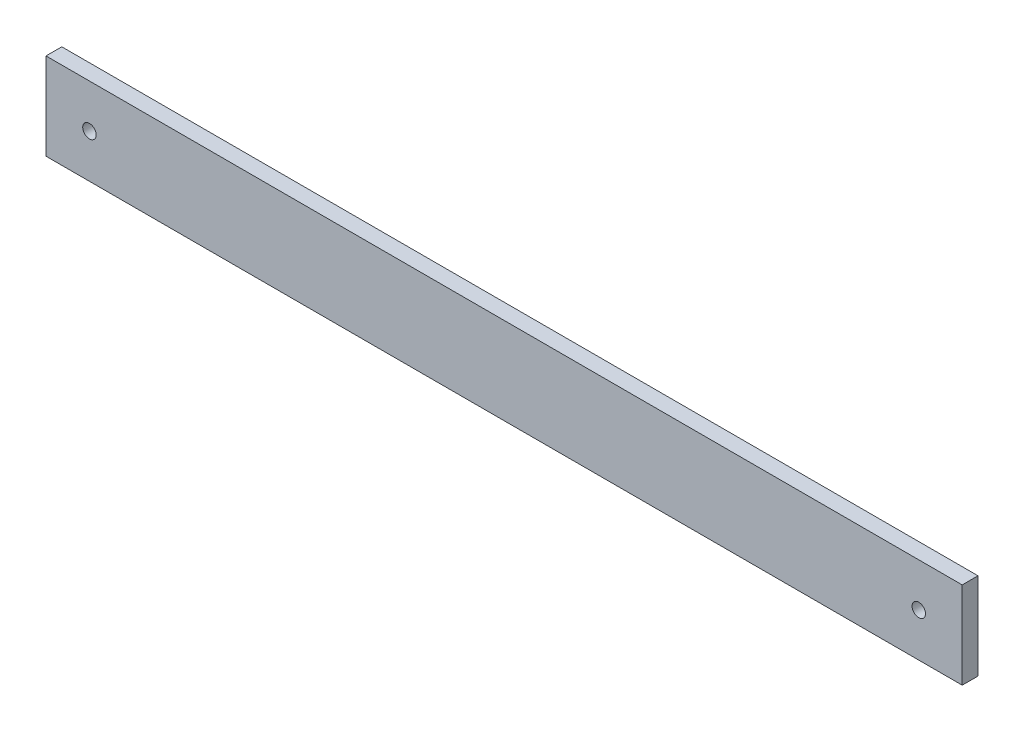
ISO-10303-21;
HEADER;
FILE_DESCRIPTION(('STEP AP214'),'2;1');
FILE_NAME('part.step','',(''),(''),'','','');
FILE_SCHEMA(('AUTOMOTIVE_DESIGN { 1 0 10303 214 1 1 1 1 }'));
ENDSEC;
DATA;
#1=APPLICATION_CONTEXT('core data for automotive mechanical design processes');
#2=APPLICATION_PROTOCOL_DEFINITION('international standard','automotive_design',2000,#1);
#3=PRODUCT_CONTEXT('',#1,'mechanical');
#4=PRODUCT('Part','Part','',(#3));
#5=PRODUCT_RELATED_PRODUCT_CATEGORY('part','',(#4));
#6=PRODUCT_DEFINITION_FORMATION('','',#4);
#7=PRODUCT_DEFINITION_CONTEXT('part definition',#1,'design');
#8=PRODUCT_DEFINITION('design','',#6,#7);
#9=PRODUCT_DEFINITION_SHAPE('','',#8);
#10=(LENGTH_UNIT() NAMED_UNIT(*) SI_UNIT(.MILLI.,.METRE.));
#11=(NAMED_UNIT(*) PLANE_ANGLE_UNIT() SI_UNIT($,.RADIAN.));
#12=(NAMED_UNIT(*) SI_UNIT($,.STERADIAN.) SOLID_ANGLE_UNIT());
#13=UNCERTAINTY_MEASURE_WITH_UNIT(LENGTH_MEASURE(1.E-05),#10,'distance_accuracy_value','');
#14=(GEOMETRIC_REPRESENTATION_CONTEXT(3) GLOBAL_UNCERTAINTY_ASSIGNED_CONTEXT((#13)) GLOBAL_UNIT_ASSIGNED_CONTEXT((#10,
#11,#12)) REPRESENTATION_CONTEXT('',''));
#15=CARTESIAN_POINT('',(0.,0.,0.));
#16=DIRECTION('',(0.,0.,1.));
#17=DIRECTION('',(1.,0.,0.));
#18=AXIS2_PLACEMENT_3D('',#15,#16,#17);
#19=CARTESIAN_POINT('',(0.,0.,2.));
#20=DIRECTION('',(0.,0.,-1.));
#21=DIRECTION('',(-1.,0.,0.));
#22=AXIS2_PLACEMENT_3D('',#19,#20,#21);
#23=PLANE('',#22);
#24=DIRECTION('',(0.,1.,0.));
#25=VECTOR('',#24,1.);
#26=CARTESIAN_POINT('',(221.,-11.,2.));
#27=LINE('',#26,#25);
#28=CARTESIAN_POINT('',(221.,-11.,2.));
#29=VERTEX_POINT('',#28);
#30=CARTESIAN_POINT('',(221.,11.,2.));
#31=VERTEX_POINT('',#30);
#32=EDGE_CURVE('E99',#29,#31,#27,.T.);
#33=ORIENTED_EDGE('',*,*,#32,.T.);
#34=DIRECTION('',(-1.,0.,0.));
#35=VECTOR('',#34,1.);
#36=CARTESIAN_POINT('',(-11.,11.,2.));
#37=LINE('',#36,#35);
#38=CARTESIAN_POINT('',(-11.,11.,2.));
#39=VERTEX_POINT('',#38);
#40=EDGE_CURVE('E92',#31,#39,#37,.T.);
#41=ORIENTED_EDGE('',*,*,#40,.T.);
#42=DIRECTION('',(0.,-1.,0.));
#43=VECTOR('',#42,1.);
#44=CARTESIAN_POINT('',(-11.,-11.,2.));
#45=LINE('',#44,#43);
#46=CARTESIAN_POINT('',(-11.,-11.,2.));
#47=VERTEX_POINT('',#46);
#48=EDGE_CURVE('E98',#39,#47,#45,.T.);
#49=ORIENTED_EDGE('',*,*,#48,.T.);
#50=DIRECTION('',(1.,0.,0.));
#51=VECTOR('',#50,1.);
#52=CARTESIAN_POINT('',(-11.,-11.,2.));
#53=LINE('',#52,#51);
#54=EDGE_CURVE('E63',#47,#29,#53,.T.);
#55=ORIENTED_EDGE('',*,*,#54,.T.);
#56=EDGE_LOOP('',(#33,#41,#49,#55));
#57=FACE_BOUND('',#56,.T.);
#58=CARTESIAN_POINT('',(0.,0.,2.));
#59=DIRECTION('',(0.,0.,1.));
#60=DIRECTION('',(1.,0.,0.));
#61=AXIS2_PLACEMENT_3D('',#58,#59,#60);
#62=CIRCLE('',#61,1.7);
#63=CARTESIAN_POINT('',(1.7,0.,2.));
#64=VERTEX_POINT('',#63);
#65=EDGE_CURVE('E113',#64,#64,#62,.T.);
#66=ORIENTED_EDGE('',*,*,#65,.F.);
#67=EDGE_LOOP('',(#66));
#68=FACE_BOUND('',#67,.T.);
#69=CARTESIAN_POINT('',(210.,0.,2.));
#70=DIRECTION('',(0.,0.,1.));
#71=DIRECTION('',(1.,0.,0.));
#72=AXIS2_PLACEMENT_3D('',#69,#70,#71);
#73=CIRCLE('',#72,1.70000000000001);
#74=CARTESIAN_POINT('',(211.7,0.,2.));
#75=VERTEX_POINT('',#74);
#76=EDGE_CURVE('E128',#75,#75,#73,.T.);
#77=ORIENTED_EDGE('',*,*,#76,.F.);
#78=EDGE_LOOP('',(#77));
#79=FACE_BOUND('',#78,.T.);
#80=ADVANCED_FACE('F50',(#57,#68,#79),#23,.F.);
#81=CARTESIAN_POINT('',(0.,0.,-2.));
#82=DIRECTION('',(0.,0.,-1.));
#83=DIRECTION('',(-1.,0.,0.));
#84=AXIS2_PLACEMENT_3D('',#81,#82,#83);
#85=PLANE('',#84);
#86=CARTESIAN_POINT('',(0.,0.,-2.));
#87=DIRECTION('',(0.,0.,1.));
#88=DIRECTION('',(1.,0.,0.));
#89=AXIS2_PLACEMENT_3D('',#86,#87,#88);
#90=CIRCLE('',#89,1.7);
#91=CARTESIAN_POINT('',(1.7,0.,-2.));
#92=VERTEX_POINT('',#91);
#93=EDGE_CURVE('E130',#92,#92,#90,.T.);
#94=ORIENTED_EDGE('',*,*,#93,.T.);
#95=EDGE_LOOP('',(#94));
#96=FACE_BOUND('',#95,.T.);
#97=DIRECTION('',(0.,1.,0.));
#98=VECTOR('',#97,1.);
#99=CARTESIAN_POINT('',(221.,-11.,-2.));
#100=LINE('',#99,#98);
#101=CARTESIAN_POINT('',(221.,-11.,-2.));
#102=VERTEX_POINT('',#101);
#103=CARTESIAN_POINT('',(221.,11.,-2.));
#104=VERTEX_POINT('',#103);
#105=EDGE_CURVE('E115',#102,#104,#100,.T.);
#106=ORIENTED_EDGE('',*,*,#105,.F.);
#107=DIRECTION('',(1.,0.,0.));
#108=VECTOR('',#107,1.);
#109=CARTESIAN_POINT('',(-11.,-11.,-2.));
#110=LINE('',#109,#108);
#111=CARTESIAN_POINT('',(-11.,-11.,-2.));
#112=VERTEX_POINT('',#111);
#113=EDGE_CURVE('E86',#112,#102,#110,.T.);
#114=ORIENTED_EDGE('',*,*,#113,.F.);
#115=DIRECTION('',(0.,-1.,0.));
#116=VECTOR('',#115,1.);
#117=CARTESIAN_POINT('',(-11.,-11.,-2.));
#118=LINE('',#117,#116);
#119=CARTESIAN_POINT('',(-11.,11.,-2.));
#120=VERTEX_POINT('',#119);
#121=EDGE_CURVE('E82',#120,#112,#118,.T.);
#122=ORIENTED_EDGE('',*,*,#121,.F.);
#123=DIRECTION('',(-1.,0.,0.));
#124=VECTOR('',#123,1.);
#125=CARTESIAN_POINT('',(-11.,11.,-2.));
#126=LINE('',#125,#124);
#127=EDGE_CURVE('E102',#104,#120,#126,.T.);
#128=ORIENTED_EDGE('',*,*,#127,.F.);
#129=EDGE_LOOP('',(#106,#114,#122,#128));
#130=FACE_BOUND('',#129,.T.);
#131=CARTESIAN_POINT('',(210.,0.,-2.));
#132=DIRECTION('',(0.,0.,1.));
#133=DIRECTION('',(1.,0.,0.));
#134=AXIS2_PLACEMENT_3D('',#131,#132,#133);
#135=CIRCLE('',#134,1.70000000000001);
#136=CARTESIAN_POINT('',(211.7,0.,-2.));
#137=VERTEX_POINT('',#136);
#138=EDGE_CURVE('E135',#137,#137,#135,.T.);
#139=ORIENTED_EDGE('',*,*,#138,.T.);
#140=EDGE_LOOP('',(#139));
#141=FACE_BOUND('',#140,.T.);
#142=ADVANCED_FACE('F124',(#96,#130,#141),#85,.T.);
#143=CARTESIAN_POINT('',(221.,-11.,2.));
#144=DIRECTION('',(-1.,0.,0.));
#145=DIRECTION('',(0.,0.,1.));
#146=AXIS2_PLACEMENT_3D('',#143,#144,#145);
#147=PLANE('',#146);
#148=ORIENTED_EDGE('',*,*,#105,.T.);
#149=DIRECTION('',(0.,0.,-1.));
#150=VECTOR('',#149,1.);
#151=CARTESIAN_POINT('',(221.,11.,2.));
#152=LINE('',#151,#150);
#153=EDGE_CURVE('E11',#31,#104,#152,.T.);
#154=ORIENTED_EDGE('',*,*,#153,.F.);
#155=ORIENTED_EDGE('',*,*,#32,.F.);
#156=DIRECTION('',(0.,0.,-1.));
#157=VECTOR('',#156,1.);
#158=CARTESIAN_POINT('',(221.,-11.,2.));
#159=LINE('',#158,#157);
#160=EDGE_CURVE('E107',#29,#102,#159,.T.);
#161=ORIENTED_EDGE('',*,*,#160,.T.);
#162=EDGE_LOOP('',(#148,#154,#155,#161));
#163=FACE_BOUND('',#162,.T.);
#164=ADVANCED_FACE('F49',(#163),#147,.F.);
#165=CARTESIAN_POINT('',(-11.,11.,2.));
#166=DIRECTION('',(0.,-1.,0.));
#167=DIRECTION('',(0.,0.,-1.));
#168=AXIS2_PLACEMENT_3D('',#165,#166,#167);
#169=PLANE('',#168);
#170=ORIENTED_EDGE('',*,*,#127,.T.);
#171=DIRECTION('',(0.,0.,-1.));
#172=VECTOR('',#171,1.);
#173=CARTESIAN_POINT('',(-11.,11.,2.));
#174=LINE('',#173,#172);
#175=EDGE_CURVE('E60',#39,#120,#174,.T.);
#176=ORIENTED_EDGE('',*,*,#175,.F.);
#177=ORIENTED_EDGE('',*,*,#40,.F.);
#178=ORIENTED_EDGE('',*,*,#153,.T.);
#179=EDGE_LOOP('',(#170,#176,#177,#178));
#180=FACE_BOUND('',#179,.T.);
#181=ADVANCED_FACE('F103',(#180),#169,.F.);
#182=CARTESIAN_POINT('',(-11.,-11.,2.));
#183=DIRECTION('',(1.,0.,0.));
#184=DIRECTION('',(0.,0.,-1.));
#185=AXIS2_PLACEMENT_3D('',#182,#183,#184);
#186=PLANE('',#185);
#187=ORIENTED_EDGE('',*,*,#121,.T.);
#188=DIRECTION('',(0.,0.,-1.));
#189=VECTOR('',#188,1.);
#190=CARTESIAN_POINT('',(-11.,-11.,2.));
#191=LINE('',#190,#189);
#192=EDGE_CURVE('E104',#47,#112,#191,.T.);
#193=ORIENTED_EDGE('',*,*,#192,.F.);
#194=ORIENTED_EDGE('',*,*,#48,.F.);
#195=ORIENTED_EDGE('',*,*,#175,.T.);
#196=EDGE_LOOP('',(#187,#193,#194,#195));
#197=FACE_BOUND('',#196,.T.);
#198=ADVANCED_FACE('F106',(#197),#186,.F.);
#199=CARTESIAN_POINT('',(-11.,-11.,2.));
#200=DIRECTION('',(0.,1.,0.));
#201=DIRECTION('',(0.,0.,1.));
#202=AXIS2_PLACEMENT_3D('',#199,#200,#201);
#203=PLANE('',#202);
#204=ORIENTED_EDGE('',*,*,#113,.T.);
#205=ORIENTED_EDGE('',*,*,#160,.F.);
#206=ORIENTED_EDGE('',*,*,#54,.F.);
#207=ORIENTED_EDGE('',*,*,#192,.T.);
#208=EDGE_LOOP('',(#204,#205,#206,#207));
#209=FACE_BOUND('',#208,.T.);
#210=ADVANCED_FACE('F118',(#209),#203,.F.);
#211=CARTESIAN_POINT('',(0.,0.,2.));
#212=DIRECTION('',(0.,0.,-1.));
#213=DIRECTION('',(-1.,0.,0.));
#214=AXIS2_PLACEMENT_3D('',#211,#212,#213);
#215=CYLINDRICAL_SURFACE('',#214,1.7);
#216=ORIENTED_EDGE('',*,*,#65,.T.);
#217=EDGE_LOOP('',(#216));
#218=FACE_BOUND('',#217,.T.);
#219=ORIENTED_EDGE('',*,*,#93,.F.);
#220=EDGE_LOOP('',(#219));
#221=FACE_BOUND('',#220,.T.);
#222=ADVANCED_FACE('F155',(#218,#221),#215,.F.);
#223=CARTESIAN_POINT('',(210.,0.,2.));
#224=DIRECTION('',(0.,0.,-1.));
#225=DIRECTION('',(-1.,0.,0.));
#226=AXIS2_PLACEMENT_3D('',#223,#224,#225);
#227=CYLINDRICAL_SURFACE('',#226,1.70000000000001);
#228=ORIENTED_EDGE('',*,*,#76,.T.);
#229=EDGE_LOOP('',(#228));
#230=FACE_BOUND('',#229,.T.);
#231=ORIENTED_EDGE('',*,*,#138,.F.);
#232=EDGE_LOOP('',(#231));
#233=FACE_BOUND('',#232,.T.);
#234=ADVANCED_FACE('F138',(#230,#233),#227,.F.);
#235=CLOSED_SHELL('',(#80,#142,#164,#181,#198,#210,#222,#234));
#236=MANIFOLD_SOLID_BREP('B2',#235);
#237=ADVANCED_BREP_SHAPE_REPRESENTATION('',(#18,#236),#14);
#238=SHAPE_DEFINITION_REPRESENTATION(#9,#237);
ENDSEC;
END-ISO-10303-21;
